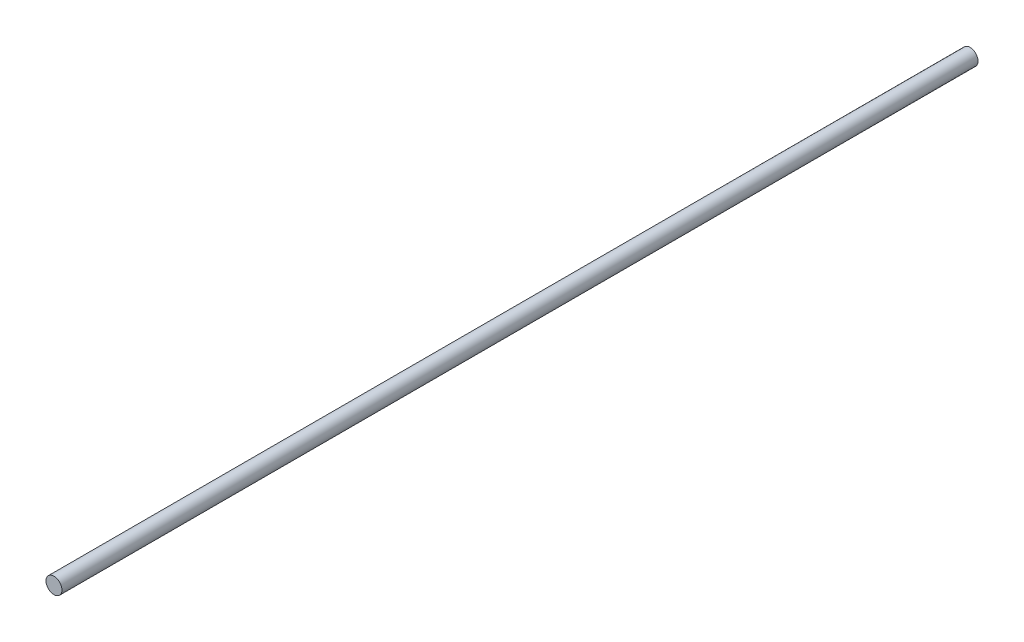
ISO-10303-21;
HEADER;
FILE_DESCRIPTION(('STEP AP214'),'2;1');
FILE_NAME('part.step','',(''),(''),'','','');
FILE_SCHEMA(('AUTOMOTIVE_DESIGN { 1 0 10303 214 1 1 1 1 }'));
ENDSEC;
DATA;
#1=APPLICATION_CONTEXT('core data for automotive mechanical design processes');
#2=APPLICATION_PROTOCOL_DEFINITION('international standard','automotive_design',2000,#1);
#3=PRODUCT_CONTEXT('',#1,'mechanical');
#4=PRODUCT('Part','Part','',(#3));
#5=PRODUCT_RELATED_PRODUCT_CATEGORY('part','',(#4));
#6=PRODUCT_DEFINITION_FORMATION('','',#4);
#7=PRODUCT_DEFINITION_CONTEXT('part definition',#1,'design');
#8=PRODUCT_DEFINITION('design','',#6,#7);
#9=PRODUCT_DEFINITION_SHAPE('','',#8);
#10=(LENGTH_UNIT() NAMED_UNIT(*) SI_UNIT(.MILLI.,.METRE.));
#11=(NAMED_UNIT(*) PLANE_ANGLE_UNIT() SI_UNIT($,.RADIAN.));
#12=(NAMED_UNIT(*) SI_UNIT($,.STERADIAN.) SOLID_ANGLE_UNIT());
#13=UNCERTAINTY_MEASURE_WITH_UNIT(LENGTH_MEASURE(1.E-05),#10,'distance_accuracy_value','');
#14=(GEOMETRIC_REPRESENTATION_CONTEXT(3) GLOBAL_UNCERTAINTY_ASSIGNED_CONTEXT((#13)) GLOBAL_UNIT_ASSIGNED_CONTEXT((#10,
#11,#12)) REPRESENTATION_CONTEXT('',''));
#15=CARTESIAN_POINT('',(0.,0.,0.));
#16=DIRECTION('',(0.,0.,1.));
#17=DIRECTION('',(1.,0.,0.));
#18=AXIS2_PLACEMENT_3D('',#15,#16,#17);
#19=CARTESIAN_POINT('',(0.,0.,172.));
#20=DIRECTION('',(0.,0.,-1.));
#21=DIRECTION('',(-1.,0.,0.));
#22=AXIS2_PLACEMENT_3D('',#19,#20,#21);
#23=CYLINDRICAL_SURFACE('',#22,1.5);
#24=CARTESIAN_POINT('',(0.,0.,172.));
#25=DIRECTION('',(0.,0.,1.));
#26=DIRECTION('',(1.,0.,0.));
#27=AXIS2_PLACEMENT_3D('',#24,#25,#26);
#28=CIRCLE('',#27,1.5);
#29=CARTESIAN_POINT('',(1.5,0.,172.));
#30=VERTEX_POINT('',#29);
#31=EDGE_CURVE('E10',#30,#30,#28,.T.);
#32=ORIENTED_EDGE('',*,*,#31,.F.);
#33=EDGE_LOOP('',(#32));
#34=FACE_BOUND('',#33,.T.);
#35=CARTESIAN_POINT('',(0.,0.,0.));
#36=DIRECTION('',(0.,0.,1.));
#37=DIRECTION('',(1.,0.,0.));
#38=AXIS2_PLACEMENT_3D('',#35,#36,#37);
#39=CIRCLE('',#38,1.5);
#40=CARTESIAN_POINT('',(1.5,0.,0.));
#41=VERTEX_POINT('',#40);
#42=EDGE_CURVE('E33',#41,#41,#39,.T.);
#43=ORIENTED_EDGE('',*,*,#42,.T.);
#44=EDGE_LOOP('',(#43));
#45=FACE_BOUND('',#44,.T.);
#46=ADVANCED_FACE('F30',(#34,#45),#23,.T.);
#47=CARTESIAN_POINT('',(0.,0.,172.));
#48=DIRECTION('',(0.,0.,1.));
#49=DIRECTION('',(1.,0.,0.));
#50=AXIS2_PLACEMENT_3D('',#47,#48,#49);
#51=PLANE('',#50);
#52=ORIENTED_EDGE('',*,*,#31,.T.);
#53=EDGE_LOOP('',(#52));
#54=FACE_BOUND('',#53,.T.);
#55=ADVANCED_FACE('F45',(#54),#51,.T.);
#56=CARTESIAN_POINT('',(0.,0.,0.));
#57=DIRECTION('',(0.,0.,1.));
#58=DIRECTION('',(1.,0.,0.));
#59=AXIS2_PLACEMENT_3D('',#56,#57,#58);
#60=PLANE('',#59);
#61=ORIENTED_EDGE('',*,*,#42,.F.);
#62=EDGE_LOOP('',(#61));
#63=FACE_BOUND('',#62,.T.);
#64=ADVANCED_FACE('F43',(#63),#60,.F.);
#65=CLOSED_SHELL('',(#46,#55,#64));
#66=MANIFOLD_SOLID_BREP('B2',#65);
#67=ADVANCED_BREP_SHAPE_REPRESENTATION('',(#18,#66),#14);
#68=SHAPE_DEFINITION_REPRESENTATION(#9,#67);
ENDSEC;
END-ISO-10303-21;
